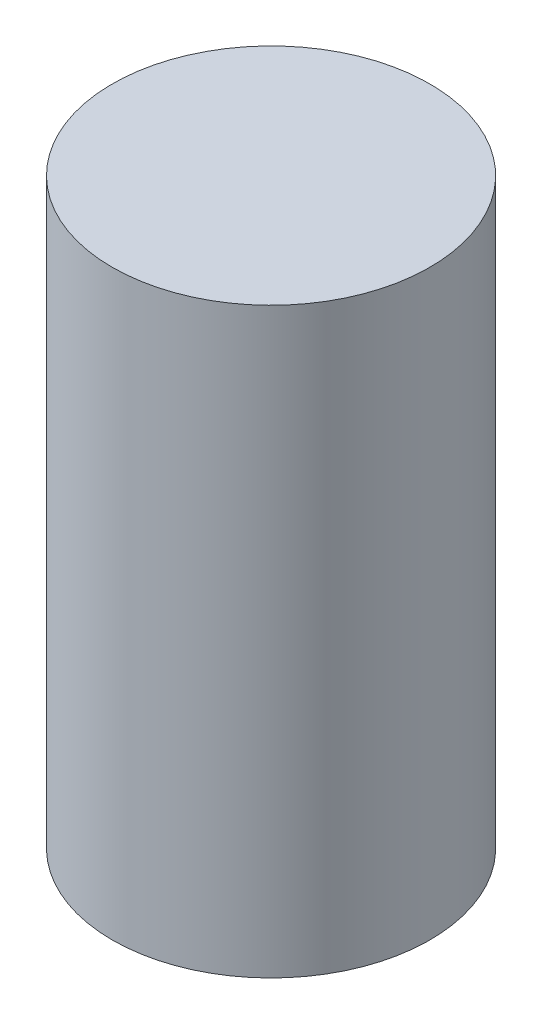
ISO-10303-21;
HEADER;
FILE_DESCRIPTION(('STEP AP214'),'2;1');
FILE_NAME('part.step','',(''),(''),'','','');
FILE_SCHEMA(('AUTOMOTIVE_DESIGN { 1 0 10303 214 1 1 1 1 }'));
ENDSEC;
DATA;
#1=APPLICATION_CONTEXT('core data for automotive mechanical design processes');
#2=APPLICATION_PROTOCOL_DEFINITION('international standard','automotive_design',2000,#1);
#3=PRODUCT_CONTEXT('',#1,'mechanical');
#4=PRODUCT('Part','Part','',(#3));
#5=PRODUCT_RELATED_PRODUCT_CATEGORY('part','',(#4));
#6=PRODUCT_DEFINITION_FORMATION('','',#4);
#7=PRODUCT_DEFINITION_CONTEXT('part definition',#1,'design');
#8=PRODUCT_DEFINITION('design','',#6,#7);
#9=PRODUCT_DEFINITION_SHAPE('','',#8);
#10=(LENGTH_UNIT() NAMED_UNIT(*) SI_UNIT(.MILLI.,.METRE.));
#11=(NAMED_UNIT(*) PLANE_ANGLE_UNIT() SI_UNIT($,.RADIAN.));
#12=(NAMED_UNIT(*) SI_UNIT($,.STERADIAN.) SOLID_ANGLE_UNIT());
#13=UNCERTAINTY_MEASURE_WITH_UNIT(LENGTH_MEASURE(1.E-05),#10,'distance_accuracy_value','');
#14=(GEOMETRIC_REPRESENTATION_CONTEXT(3) GLOBAL_UNCERTAINTY_ASSIGNED_CONTEXT((#13)) GLOBAL_UNIT_ASSIGNED_CONTEXT((#10,
#11,#12)) REPRESENTATION_CONTEXT('',''));
#15=CARTESIAN_POINT('',(0.,0.,0.));
#16=DIRECTION('',(0.,0.,1.));
#17=DIRECTION('',(1.,0.,0.));
#18=AXIS2_PLACEMENT_3D('',#15,#16,#17);
#19=CARTESIAN_POINT('',(0.,69.7,0.));
#20=DIRECTION('',(0.,-1.,0.));
#21=DIRECTION('',(0.,0.,-1.));
#22=AXIS2_PLACEMENT_3D('',#19,#20,#21);
#23=CYLINDRICAL_SURFACE('',#22,19.);
#24=CARTESIAN_POINT('',(0.,69.7,0.));
#25=DIRECTION('',(0.,1.,0.));
#26=DIRECTION('',(0.,0.,1.));
#27=AXIS2_PLACEMENT_3D('',#24,#25,#26);
#28=CIRCLE('',#27,19.);
#29=CARTESIAN_POINT('',(0.,69.7,19.));
#30=VERTEX_POINT('',#29);
#31=EDGE_CURVE('E10',#30,#30,#28,.T.);
#32=ORIENTED_EDGE('',*,*,#31,.F.);
#33=EDGE_LOOP('',(#32));
#34=FACE_BOUND('',#33,.T.);
#35=CARTESIAN_POINT('',(0.,0.,0.));
#36=DIRECTION('',(0.,1.,0.));
#37=DIRECTION('',(0.,0.,1.));
#38=AXIS2_PLACEMENT_3D('',#35,#36,#37);
#39=CIRCLE('',#38,19.);
#40=CARTESIAN_POINT('',(0.,0.,19.));
#41=VERTEX_POINT('',#40);
#42=EDGE_CURVE('E44',#41,#41,#39,.T.);
#43=ORIENTED_EDGE('',*,*,#42,.T.);
#44=EDGE_LOOP('',(#43));
#45=FACE_BOUND('',#44,.T.);
#46=ADVANCED_FACE('F41',(#34,#45),#23,.T.);
#47=CARTESIAN_POINT('',(0.,69.7,0.));
#48=DIRECTION('',(0.,1.,0.));
#49=DIRECTION('',(0.,0.,1.));
#50=AXIS2_PLACEMENT_3D('',#47,#48,#49);
#51=PLANE('',#50);
#52=ORIENTED_EDGE('',*,*,#31,.T.);
#53=EDGE_LOOP('',(#52));
#54=FACE_BOUND('',#53,.T.);
#55=ADVANCED_FACE('F56',(#54),#51,.T.);
#56=CARTESIAN_POINT('',(0.,0.,0.));
#57=DIRECTION('',(0.,1.,0.));
#58=DIRECTION('',(0.,0.,1.));
#59=AXIS2_PLACEMENT_3D('',#56,#57,#58);
#60=PLANE('',#59);
#61=ORIENTED_EDGE('',*,*,#42,.F.);
#62=EDGE_LOOP('',(#61));
#63=FACE_BOUND('',#62,.T.);
#64=ADVANCED_FACE('F54',(#63),#60,.F.);
#65=CLOSED_SHELL('',(#46,#55,#64));
#66=MANIFOLD_SOLID_BREP('B2',#65);
#67=ADVANCED_BREP_SHAPE_REPRESENTATION('',(#18,#66),#14);
#68=SHAPE_DEFINITION_REPRESENTATION(#9,#67);
ENDSEC;
END-ISO-10303-21;
